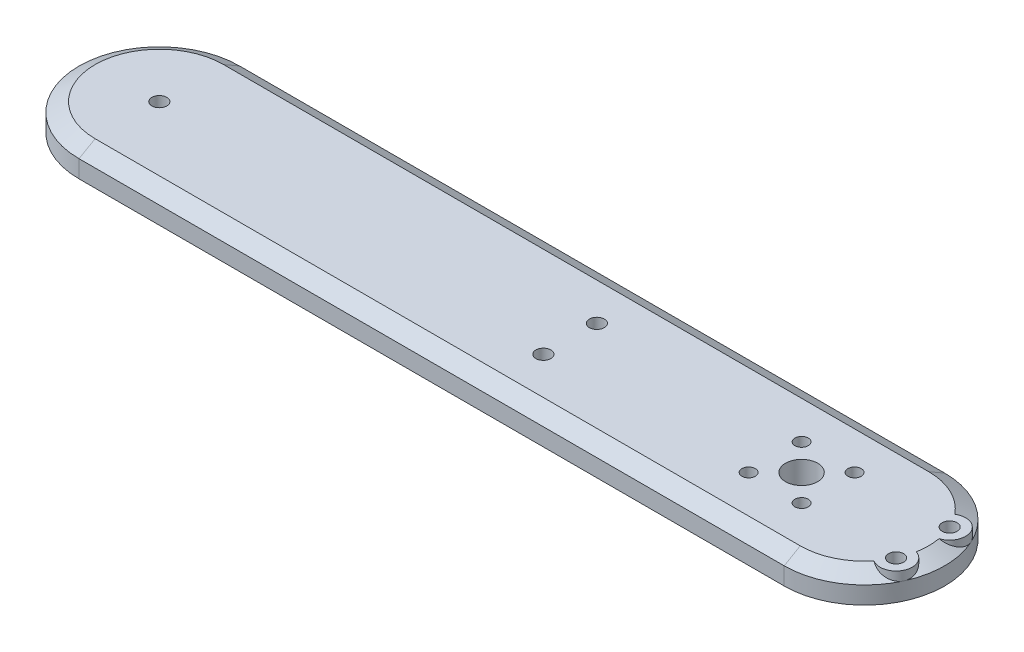
ISO-10303-21;
HEADER;
FILE_DESCRIPTION(('STEP AP214'),'2;1');
FILE_NAME('part.step','',(''),(''),'','','');
FILE_SCHEMA(('AUTOMOTIVE_DESIGN { 1 0 10303 214 1 1 1 1 }'));
ENDSEC;
DATA;
#1=APPLICATION_CONTEXT('core data for automotive mechanical design processes');
#2=APPLICATION_PROTOCOL_DEFINITION('international standard','automotive_design',2000,#1);
#3=PRODUCT_CONTEXT('',#1,'mechanical');
#4=PRODUCT('Part','Part','',(#3));
#5=PRODUCT_RELATED_PRODUCT_CATEGORY('part','',(#4));
#6=PRODUCT_DEFINITION_FORMATION('','',#4);
#7=PRODUCT_DEFINITION_CONTEXT('part definition',#1,'design');
#8=PRODUCT_DEFINITION('design','',#6,#7);
#9=PRODUCT_DEFINITION_SHAPE('','',#8);
#10=(LENGTH_UNIT() NAMED_UNIT(*) SI_UNIT(.MILLI.,.METRE.));
#11=(NAMED_UNIT(*) PLANE_ANGLE_UNIT() SI_UNIT($,.RADIAN.));
#12=(NAMED_UNIT(*) SI_UNIT($,.STERADIAN.) SOLID_ANGLE_UNIT());
#13=UNCERTAINTY_MEASURE_WITH_UNIT(LENGTH_MEASURE(1.E-05),#10,'distance_accuracy_value','');
#14=(GEOMETRIC_REPRESENTATION_CONTEXT(3) GLOBAL_UNCERTAINTY_ASSIGNED_CONTEXT((#13)) GLOBAL_UNIT_ASSIGNED_CONTEXT((#10,
#11,#12)) REPRESENTATION_CONTEXT('',''));
#15=CARTESIAN_POINT('',(0.,0.,0.));
#16=DIRECTION('',(0.,0.,1.));
#17=DIRECTION('',(1.,0.,0.));
#18=AXIS2_PLACEMENT_3D('',#15,#16,#17);
#19=CARTESIAN_POINT('',(131.75,5.,0.));
#20=DIRECTION('',(0.,-1.,0.));
#21=DIRECTION('',(0.,0.,1.));
#22=AXIS2_PLACEMENT_3D('',#19,#20,#21);
#23=CONICAL_SURFACE('',#22,12.,1.0471975511966);
#24=CARTESIAN_POINT('',(131.75,5.,0.));
#25=DIRECTION('',(0.,-1.,0.));
#26=DIRECTION('',(0.,0.,-1.));
#27=AXIS2_PLACEMENT_3D('',#24,#25,#26);
#28=CIRCLE('',#27,12.);
#29=CARTESIAN_POINT('',(141.077618933992,5.,7.54953806681159));
#30=VERTEX_POINT('',#29);
#31=CARTESIAN_POINT('',(131.75,5.,12.));
#32=VERTEX_POINT('',#31);
#33=EDGE_CURVE('E126',#30,#32,#28,.T.);
#34=ORIENTED_EDGE('',*,*,#33,.T.);
#35=DIRECTION('',(0.,0.499999999999995,-0.866025403784441));
#36=VECTOR('',#35,1.);
#37=CARTESIAN_POINT('',(131.75,3.26794919243113,15.));
#38=LINE('',#37,#36);
#39=CARTESIAN_POINT('',(131.75,3.26794919243113,15.));
#40=VERTEX_POINT('',#39);
#41=EDGE_CURVE('E157',#40,#32,#38,.T.);
#42=ORIENTED_EDGE('',*,*,#41,.F.);
#43=CARTESIAN_POINT('',(131.75,3.26794919243113,0.));
#44=DIRECTION('',(0.,-1.,0.));
#45=DIRECTION('',(0.,0.,-1.));
#46=AXIS2_PLACEMENT_3D('',#43,#44,#45);
#47=CIRCLE('',#46,15.);
#48=CARTESIAN_POINT('',(145.385890143295,3.26794919243115,6.25));
#49=VERTEX_POINT('',#48);
#50=EDGE_CURVE('E146',#40,#49,#47,.F.);
#51=ORIENTED_EDGE('',*,*,#50,.T.);
#52=CARTESIAN_POINT('',(141.077322224237,5.0002,7.54935403868238));
#53=CARTESIAN_POINT('',(141.156557252533,4.94678817044797,7.59849532245087));
#54=CARTESIAN_POINT('',(141.238157752973,4.89363214228214,7.64400414252746));
#55=CARTESIAN_POINT('',(141.405675913293,4.78807578622649,7.72739358204015));
#56=CARTESIAN_POINT('',(141.491595007884,4.73567571701977,7.76527164519904));
#57=CARTESIAN_POINT('',(141.755674700648,4.57970582150423,7.86707972239534));
#58=CARTESIAN_POINT('',(141.939658060023,4.47770274482218,7.9188722322073));
#59=CARTESIAN_POINT('',(142.318130790524,4.28039509828638,7.98681766693718));
#60=CARTESIAN_POINT('',(142.512644761588,4.18510752549572,8.00288309639194));
#61=CARTESIAN_POINT('',(142.905273479851,4.00426126042279,7.99627527436065));
#62=CARTESIAN_POINT('',(143.103381423363,3.91868603955574,7.97366892195534));
#63=CARTESIAN_POINT('',(143.479570242659,3.76653113962029,7.89137434460179));
#64=CARTESIAN_POINT('',(143.657943074556,3.69896232923984,7.83493708454001));
#65=CARTESIAN_POINT('',(143.917769278529,3.60717328589838,7.72464089293876));
#66=CARTESIAN_POINT('',(144.003120344002,3.57816170009228,7.68358149180941));
#67=CARTESIAN_POINT('',(144.170380115844,3.52357315458263,7.593048925895));
#68=CARTESIAN_POINT('',(144.252289255344,3.49799576182667,7.54357682373976));
#69=CARTESIAN_POINT('',(144.473365142052,3.43219915627915,7.39498703090635));
#70=CARTESIAN_POINT('',(144.607925303175,3.39591763412093,7.28702479306738));
#71=CARTESIAN_POINT('',(144.857786247804,3.33634694159049,7.04791607168051));
#72=CARTESIAN_POINT('',(144.973101256229,3.31304814506793,6.91678686074889));
#73=CARTESIAN_POINT('',(145.17061181912,3.28175697218575,6.64792576225177));
#74=CARTESIAN_POINT('',(145.254843331859,3.27258533345847,6.51182432536301));
#75=CARTESIAN_POINT('',(145.400634043372,3.26604279846284,6.22773560641844));
#76=CARTESIAN_POINT('',(145.46219944674,3.26866867015588,6.07975159061647));
#77=CARTESIAN_POINT('',(145.558959984953,3.28529330605756,5.78235505494448));
#78=CARTESIAN_POINT('',(145.595078374449,3.29885072054545,5.63321644011285));
#79=CARTESIAN_POINT('',(145.64412187416,3.33635060085029,5.33247956634609));
#80=CARTESIAN_POINT('',(145.657047018265,3.36029305149308,5.18088131100518));
#81=CARTESIAN_POINT('',(145.660100556809,3.41834505023927,4.87679354111265));
#82=CARTESIAN_POINT('',(145.649840452357,3.45261939971543,4.72433217892598));
#83=CARTESIAN_POINT('',(145.606972106302,3.53023187094797,4.42498204919223));
#84=CARTESIAN_POINT('',(145.574357809823,3.57357244618014,4.27809480283431));
#85=CARTESIAN_POINT('',(145.485912140682,3.67126155153085,3.98414475732932));
#86=CARTESIAN_POINT('',(145.428740320811,3.72613365451266,3.83766084394096));
#87=CARTESIAN_POINT('',(145.293933076532,3.84359357328929,3.55786580455139));
#88=CARTESIAN_POINT('',(145.216294424116,3.9061826053613,3.4245567610423));
#89=CARTESIAN_POINT('',(145.03531961341,4.04396825769636,3.16165162296553));
#90=CARTESIAN_POINT('',(144.930256154494,4.11979678183466,3.03357664651882));
#91=CARTESIAN_POINT('',(144.702831974037,4.27756085315734,2.79808492927117));
#92=CARTESIAN_POINT('',(144.580452359524,4.35950302391616,2.69069105904553));
#93=CARTESIAN_POINT('',(144.314666021577,4.53273442564728,2.49265184098019));
#94=CARTESIAN_POINT('',(144.170458773441,4.62429020833901,2.40330840728901));
#95=CARTESIAN_POINT('',(143.946044711935,4.76388810854373,2.2889431581038));
#96=CARTESIAN_POINT('',(143.869946077227,4.81076421782348,2.25411406625342));
#97=CARTESIAN_POINT('',(143.71544404268,4.90509300797885,2.19103843568445));
#98=CARTESIAN_POINT('',(143.637041267394,4.95254553060478,2.16279013139787));
#99=CARTESIAN_POINT('',(143.557677692172,5.0002,2.1378572903497));
#100=B_SPLINE_CURVE_WITH_KNOTS('',3,(#52,#53,#54,#55,#56,#57,#58,#59,#60,#61,#62,#63,#64,#65,
#66,#67,#68,#69,#70,#71,#72,#73,#74,#75,#76,#77,#78,#79,#80,#81,#82,#83,#84,#85,#86,#87,#88,#89,
#90,#91,#92,#93,#94,#95,#96,#97,#98,#99),.UNSPECIFIED.,.F.,.F.,(4,2,2,2,2,2,2,2,2,2,2,2,2,2,2,2,
2,2,2,2,2,2,2,4),(0.,0.322173911690686,0.644455571713664,1.29102840714377,1.93918296091373,
2.58621739284114,3.17927178079538,3.47602612178941,3.77274300678716,4.29849498135217,
4.82385661224603,5.30238850109786,5.78078929964634,6.24078815170038,6.70078633162677,
7.16854941823068,7.63643925366799,8.1339829991462,8.63160526375324,9.17590331670913,
9.72079987775979,10.2967240672052,10.584280375072,10.8717594450089),.UNSPECIFIED.);
#101=EDGE_CURVE('E11',#30,#49,#100,.T.);
#102=ORIENTED_EDGE('',*,*,#101,.F.);
#103=EDGE_LOOP('',(#34,#42,#51,#102));
#104=FACE_BOUND('',#103,.T.);
#105=ADVANCED_FACE('F43',(#104),#23,.T.);
#106=CARTESIAN_POINT('',(145.385890143295,3.26794919243115,-6.25));
#107=VERTEX_POINT('',#106);
#108=EDGE_CURVE('E149',#49,#107,#47,.F.);
#109=ORIENTED_EDGE('',*,*,#108,.T.);
#110=CARTESIAN_POINT('',(141.077322224237,5.0002,-7.54935403868238));
#111=CARTESIAN_POINT('',(141.156557252533,4.94678817044797,-7.59849532245087));
#112=CARTESIAN_POINT('',(141.238157752973,4.89363214228214,-7.64400414252746));
#113=CARTESIAN_POINT('',(141.405675913293,4.78807578622649,-7.72739358204015));
#114=CARTESIAN_POINT('',(141.491595007884,4.73567571701977,-7.76527164519904));
#115=CARTESIAN_POINT('',(141.755674700648,4.57970582150423,-7.86707972239534));
#116=CARTESIAN_POINT('',(141.939658060023,4.47770274482218,-7.9188722322073));
#117=CARTESIAN_POINT('',(142.318130790524,4.28039509828638,-7.98681766693718));
#118=CARTESIAN_POINT('',(142.512644761588,4.18510752549572,-8.00288309639194));
#119=CARTESIAN_POINT('',(142.905273479851,4.00426126042279,-7.99627527436065));
#120=CARTESIAN_POINT('',(143.103381423363,3.91868603955574,-7.97366892195534));
#121=CARTESIAN_POINT('',(143.479570242659,3.76653113962029,-7.89137434460179));
#122=CARTESIAN_POINT('',(143.657943074556,3.69896232923984,-7.83493708454001));
#123=CARTESIAN_POINT('',(143.917769278529,3.60717328589838,-7.72464089293876));
#124=CARTESIAN_POINT('',(144.003120344002,3.57816170009228,-7.68358149180941));
#125=CARTESIAN_POINT('',(144.170380115844,3.52357315458263,-7.593048925895));
#126=CARTESIAN_POINT('',(144.252289255344,3.49799576182667,-7.54357682373976));
#127=CARTESIAN_POINT('',(144.473365142052,3.43219915627915,-7.39498703090635));
#128=CARTESIAN_POINT('',(144.607925303175,3.39591763412093,-7.28702479306738));
#129=CARTESIAN_POINT('',(144.857786247804,3.33634694159049,-7.04791607168051));
#130=CARTESIAN_POINT('',(144.973101256229,3.31304814506793,-6.91678686074889));
#131=CARTESIAN_POINT('',(145.17061181912,3.28175697218575,-6.64792576225177));
#132=CARTESIAN_POINT('',(145.254843331859,3.27258533345847,-6.51182432536301));
#133=CARTESIAN_POINT('',(145.400634043372,3.26604279846284,-6.22773560641844));
#134=CARTESIAN_POINT('',(145.46219944674,3.26866867015588,-6.07975159061647));
#135=CARTESIAN_POINT('',(145.558959984953,3.28529330605756,-5.78235505494448));
#136=CARTESIAN_POINT('',(145.595078374449,3.29885072054545,-5.63321644011285));
#137=CARTESIAN_POINT('',(145.64412187416,3.33635060085029,-5.33247956634609));
#138=CARTESIAN_POINT('',(145.657047018265,3.36029305149308,-5.18088131100518));
#139=CARTESIAN_POINT('',(145.660100556809,3.41834505023927,-4.87679354111265));
#140=CARTESIAN_POINT('',(145.649840452357,3.45261939971543,-4.72433217892598));
#141=CARTESIAN_POINT('',(145.606972106302,3.53023187094797,-4.42498204919223));
#142=CARTESIAN_POINT('',(145.574357809823,3.57357244618014,-4.27809480283431));
#143=CARTESIAN_POINT('',(145.485912140682,3.67126155153085,-3.98414475732932));
#144=CARTESIAN_POINT('',(145.428740320811,3.72613365451266,-3.83766084394096));
#145=CARTESIAN_POINT('',(145.293933076532,3.84359357328929,-3.55786580455139));
#146=CARTESIAN_POINT('',(145.216294424116,3.9061826053613,-3.4245567610423));
#147=CARTESIAN_POINT('',(145.03531961341,4.04396825769636,-3.16165162296553));
#148=CARTESIAN_POINT('',(144.930256154494,4.11979678183466,-3.03357664651882));
#149=CARTESIAN_POINT('',(144.702831974037,4.27756085315734,-2.79808492927117));
#150=CARTESIAN_POINT('',(144.580452359524,4.35950302391616,-2.69069105904553));
#151=CARTESIAN_POINT('',(144.314666021577,4.53273442564728,-2.49265184098019));
#152=CARTESIAN_POINT('',(144.170458773441,4.62429020833901,-2.40330840728901));
#153=CARTESIAN_POINT('',(143.946044711935,4.76388810854373,-2.2889431581038));
#154=CARTESIAN_POINT('',(143.869946077227,4.81076421782348,-2.25411406625342));
#155=CARTESIAN_POINT('',(143.71544404268,4.90509300797885,-2.19103843568445));
#156=CARTESIAN_POINT('',(143.637041267394,4.95254553060478,-2.16279013139787));
#157=CARTESIAN_POINT('',(143.557677692172,5.0002,-2.1378572903497));
#158=B_SPLINE_CURVE_WITH_KNOTS('',3,(#110,#111,#112,#113,#114,#115,#116,#117,#118,#119,#120,
#121,#122,#123,#124,#125,#126,#127,#128,#129,#130,#131,#132,#133,#134,#135,#136,#137,#138,#139,
#140,#141,#142,#143,#144,#145,#146,#147,#148,#149,#150,#151,#152,#153,#154,#155,#156,#157),
.UNSPECIFIED.,.F.,.F.,(4,2,2,2,2,2,2,2,2,2,2,2,2,2,2,2,2,2,2,2,2,2,2,4),(0.,0.322173911690686,
0.644455571713664,1.29102840714377,1.93918296091373,2.58621739284114,3.17927178079538,
3.47602612178941,3.77274300678716,4.29849498135217,4.82385661224603,5.30238850109786,
5.78078929964634,6.24078815170038,6.70078633162677,7.16854941823068,7.63643925366799,
8.1339829991462,8.63160526375324,9.17590331670913,9.72079987775979,10.2967240672052,
10.584280375072,10.8717594450089),.UNSPECIFIED.);
#159=CARTESIAN_POINT('',(143.558010788115,5.,-2.13796193318842));
#160=VERTEX_POINT('',#159);
#161=EDGE_CURVE('E137',#107,#160,#158,.T.);
#162=ORIENTED_EDGE('',*,*,#161,.T.);
#163=CARTESIAN_POINT('',(143.558010788115,5.,2.13796193318843));
#164=VERTEX_POINT('',#163);
#165=EDGE_CURVE('E123',#160,#164,#28,.T.);
#166=ORIENTED_EDGE('',*,*,#165,.T.);
#167=EDGE_CURVE('E47',#49,#164,#100,.T.);
#168=ORIENTED_EDGE('',*,*,#167,.F.);
#169=EDGE_LOOP('',(#109,#162,#166,#168));
#170=FACE_BOUND('',#169,.T.);
#171=ADVANCED_FACE('F136',(#170),#23,.T.);
#172=CARTESIAN_POINT('',(141.077618933992,5.,-7.54953806681159));
#173=VERTEX_POINT('',#172);
#174=EDGE_CURVE('E135',#173,#107,#158,.T.);
#175=ORIENTED_EDGE('',*,*,#174,.T.);
#176=CARTESIAN_POINT('',(131.75,3.26794919243113,-15.));
#177=VERTEX_POINT('',#176);
#178=EDGE_CURVE('E141',#107,#177,#47,.F.);
#179=ORIENTED_EDGE('',*,*,#178,.T.);
#180=DIRECTION('',(0.,-0.499999999999995,-0.866025403784441));
#181=VECTOR('',#180,1.);
#182=CARTESIAN_POINT('',(131.75,5.,-12.));
#183=LINE('',#182,#181);
#184=CARTESIAN_POINT('',(131.75,5.,-12.));
#185=VERTEX_POINT('',#184);
#186=EDGE_CURVE('E160',#185,#177,#183,.T.);
#187=ORIENTED_EDGE('',*,*,#186,.F.);
#188=EDGE_CURVE('E138',#185,#173,#28,.T.);
#189=ORIENTED_EDGE('',*,*,#188,.T.);
#190=EDGE_LOOP('',(#175,#179,#187,#189));
#191=FACE_BOUND('',#190,.T.);
#192=ADVANCED_FACE('F182',(#191),#23,.T.);
#193=CARTESIAN_POINT('',(0.,5.,0.));
#194=DIRECTION('',(0.,1.,0.));
#195=DIRECTION('',(0.,0.,-1.));
#196=AXIS2_PLACEMENT_3D('',#193,#194,#195);
#197=PLANE('',#196);
#198=CARTESIAN_POINT('',(142.658712114636,5.,5.));
#199=DIRECTION('',(0.,1.,0.));
#200=DIRECTION('',(0.,0.,1.));
#201=AXIS2_PLACEMENT_3D('',#198,#199,#200);
#202=CIRCLE('',#201,1.4);
#203=CARTESIAN_POINT('',(142.658712114636,5.,6.40000000000001));
#204=VERTEX_POINT('',#203);
#205=EDGE_CURVE('E305',#204,#204,#202,.T.);
#206=ORIENTED_EDGE('',*,*,#205,.F.);
#207=EDGE_LOOP('',(#206));
#208=FACE_BOUND('',#207,.T.);
#209=CARTESIAN_POINT('',(142.658712114636,5.,-5.));
#210=DIRECTION('',(0.,-1.,0.));
#211=DIRECTION('',(0.,0.,-1.));
#212=AXIS2_PLACEMENT_3D('',#209,#210,#211);
#213=CIRCLE('',#212,1.4);
#214=CARTESIAN_POINT('',(142.658712114636,5.,-6.40000000000001));
#215=VERTEX_POINT('',#214);
#216=EDGE_CURVE('E127',#215,#215,#213,.T.);
#217=ORIENTED_EDGE('',*,*,#216,.T.);
#218=EDGE_LOOP('',(#217));
#219=FACE_BOUND('',#218,.T.);
#220=ORIENTED_EDGE('',*,*,#165,.F.);
#221=CARTESIAN_POINT('',(142.658712114636,5.,-5.));
#222=DIRECTION('',(0.,-1.,0.));
#223=DIRECTION('',(0.,0.,-1.));
#224=AXIS2_PLACEMENT_3D('',#221,#222,#223);
#225=CIRCLE('',#224,2.99999999999999);
#226=EDGE_CURVE('E71',#173,#160,#225,.T.);
#227=ORIENTED_EDGE('',*,*,#226,.F.);
#228=ORIENTED_EDGE('',*,*,#188,.F.);
#229=DIRECTION('',(1.,0.,0.));
#230=VECTOR('',#229,1.);
#231=CARTESIAN_POINT('',(131.75,5.,-12.));
#232=LINE('',#231,#230);
#233=CARTESIAN_POINT('',(0.,5.,-12.));
#234=VERTEX_POINT('',#233);
#235=EDGE_CURVE('E142',#234,#185,#232,.T.);
#236=ORIENTED_EDGE('',*,*,#235,.F.);
#237=CARTESIAN_POINT('',(0.,5.,0.));
#238=DIRECTION('',(0.,-1.,0.));
#239=DIRECTION('',(0.,0.,-1.));
#240=AXIS2_PLACEMENT_3D('',#237,#238,#239);
#241=CIRCLE('',#240,12.);
#242=CARTESIAN_POINT('',(0.,5.,12.));
#243=VERTEX_POINT('',#242);
#244=EDGE_CURVE('E203',#243,#234,#241,.T.);
#245=ORIENTED_EDGE('',*,*,#244,.F.);
#246=DIRECTION('',(-1.,0.,0.));
#247=VECTOR('',#246,1.);
#248=CARTESIAN_POINT('',(0.,5.,12.));
#249=LINE('',#248,#247);
#250=EDGE_CURVE('E205',#32,#243,#249,.T.);
#251=ORIENTED_EDGE('',*,*,#250,.F.);
#252=ORIENTED_EDGE('',*,*,#33,.F.);
#253=CARTESIAN_POINT('',(142.658712114636,5.,5.));
#254=DIRECTION('',(0.,1.,0.));
#255=DIRECTION('',(0.,0.,1.));
#256=AXIS2_PLACEMENT_3D('',#253,#254,#255);
#257=CIRCLE('',#256,2.99999999999999);
#258=EDGE_CURVE('E63',#30,#164,#257,.T.);
#259=ORIENTED_EDGE('',*,*,#258,.T.);
#260=EDGE_LOOP('',(#220,#227,#228,#236,#245,#251,#252,#259));
#261=FACE_BOUND('',#260,.T.);
#262=CARTESIAN_POINT('',(76.75,5.,4.99999999999999));
#263=DIRECTION('',(0.,-1.,0.));
#264=DIRECTION('',(0.,0.,-1.));
#265=AXIS2_PLACEMENT_3D('',#262,#263,#264);
#266=CIRCLE('',#265,1.4);
#267=CARTESIAN_POINT('',(76.75,5.,3.59999999999999));
#268=VERTEX_POINT('',#267);
#269=EDGE_CURVE('E294',#268,#268,#266,.T.);
#270=ORIENTED_EDGE('',*,*,#269,.T.);
#271=EDGE_LOOP('',(#270));
#272=FACE_BOUND('',#271,.T.);
#273=CARTESIAN_POINT('',(76.75,5.,-5.00000000000001));
#274=DIRECTION('',(0.,-1.,0.));
#275=DIRECTION('',(0.,0.,1.));
#276=AXIS2_PLACEMENT_3D('',#273,#274,#275);
#277=CIRCLE('',#276,1.4);
#278=CARTESIAN_POINT('',(76.75,5.,-3.60000000000001));
#279=VERTEX_POINT('',#278);
#280=EDGE_CURVE('E291',#279,#279,#277,.T.);
#281=ORIENTED_EDGE('',*,*,#280,.T.);
#282=EDGE_LOOP('',(#281));
#283=FACE_BOUND('',#282,.T.);
#284=CARTESIAN_POINT('',(124.949747468306,5.,-4.9497474683058));
#285=DIRECTION('',(0.,-1.,0.));
#286=DIRECTION('',(0.,0.,-1.));
#287=AXIS2_PLACEMENT_3D('',#284,#285,#286);
#288=CIRCLE('',#287,1.25000000000001);
#289=CARTESIAN_POINT('',(124.949747468306,5.,-6.19974746830581));
#290=VERTEX_POINT('',#289);
#291=EDGE_CURVE('E275',#290,#290,#288,.T.);
#292=ORIENTED_EDGE('',*,*,#291,.T.);
#293=EDGE_LOOP('',(#292));
#294=FACE_BOUND('',#293,.T.);
#295=CARTESIAN_POINT('',(124.949747468306,5.,4.94974746830584));
#296=DIRECTION('',(0.,-1.,0.));
#297=DIRECTION('',(0.,0.,-1.));
#298=AXIS2_PLACEMENT_3D('',#295,#296,#297);
#299=CIRCLE('',#298,1.25);
#300=CARTESIAN_POINT('',(124.949747468306,5.,3.69974746830585));
#301=VERTEX_POINT('',#300);
#302=EDGE_CURVE('E263',#301,#301,#299,.T.);
#303=ORIENTED_EDGE('',*,*,#302,.T.);
#304=EDGE_LOOP('',(#303));
#305=FACE_BOUND('',#304,.T.);
#306=CARTESIAN_POINT('',(120.,5.,0.));
#307=DIRECTION('',(0.,-1.,0.));
#308=DIRECTION('',(0.,0.,-1.));
#309=AXIS2_PLACEMENT_3D('',#306,#307,#308);
#310=CIRCLE('',#309,2.99999999999999);
#311=CARTESIAN_POINT('',(120.,5.,-2.99999999999999));
#312=VERTEX_POINT('',#311);
#313=EDGE_CURVE('E250',#312,#312,#310,.T.);
#314=ORIENTED_EDGE('',*,*,#313,.T.);
#315=EDGE_LOOP('',(#314));
#316=FACE_BOUND('',#315,.T.);
#317=CARTESIAN_POINT('',(115.050252531694,5.,4.9497474683058));
#318=DIRECTION('',(0.,-1.,0.));
#319=DIRECTION('',(0.,0.,-1.));
#320=AXIS2_PLACEMENT_3D('',#317,#318,#319);
#321=CIRCLE('',#320,1.25);
#322=CARTESIAN_POINT('',(115.050252531694,5.,3.6997474683058));
#323=VERTEX_POINT('',#322);
#324=EDGE_CURVE('E258',#323,#323,#321,.T.);
#325=ORIENTED_EDGE('',*,*,#324,.T.);
#326=EDGE_LOOP('',(#325));
#327=FACE_BOUND('',#326,.T.);
#328=CARTESIAN_POINT('',(0.,5.,0.));
#329=DIRECTION('',(0.,-1.,0.));
#330=DIRECTION('',(0.,0.,-1.));
#331=AXIS2_PLACEMENT_3D('',#328,#329,#330);
#332=CIRCLE('',#331,1.4);
#333=CARTESIAN_POINT('',(0.,5.,-1.4));
#334=VERTEX_POINT('',#333);
#335=EDGE_CURVE('E269',#334,#334,#332,.T.);
#336=ORIENTED_EDGE('',*,*,#335,.T.);
#337=EDGE_LOOP('',(#336));
#338=FACE_BOUND('',#337,.T.);
#339=CARTESIAN_POINT('',(115.050252531694,5.,-4.94974746830584));
#340=DIRECTION('',(0.,-1.,0.));
#341=DIRECTION('',(0.,0.,-1.));
#342=AXIS2_PLACEMENT_3D('',#339,#340,#341);
#343=CIRCLE('',#342,1.25);
#344=CARTESIAN_POINT('',(115.050252531694,5.,-6.19974746830584));
#345=VERTEX_POINT('',#344);
#346=EDGE_CURVE('E281',#345,#345,#343,.T.);
#347=ORIENTED_EDGE('',*,*,#346,.T.);
#348=EDGE_LOOP('',(#347));
#349=FACE_BOUND('',#348,.T.);
#350=ADVANCED_FACE('F120',(#208,#219,#261,#272,#283,#294,#305,#316,#327,#338,#349),#197,.T.);
#351=CARTESIAN_POINT('',(0.,0.,0.));
#352=DIRECTION('',(0.,1.,0.));
#353=DIRECTION('',(0.,0.,-1.));
#354=AXIS2_PLACEMENT_3D('',#351,#352,#353);
#355=PLANE('',#354);
#356=CARTESIAN_POINT('',(142.658712114636,0.,5.));
#357=DIRECTION('',(0.,1.,0.));
#358=DIRECTION('',(0.,0.,1.));
#359=AXIS2_PLACEMENT_3D('',#356,#357,#358);
#360=CIRCLE('',#359,1.4);
#361=CARTESIAN_POINT('',(142.658712114636,0.,6.40000000000001));
#362=VERTEX_POINT('',#361);
#363=EDGE_CURVE('E128',#362,#362,#360,.T.);
#364=ORIENTED_EDGE('',*,*,#363,.T.);
#365=EDGE_LOOP('',(#364));
#366=FACE_BOUND('',#365,.T.);
#367=CARTESIAN_POINT('',(142.658712114636,0.,-5.));
#368=DIRECTION('',(0.,-1.,0.));
#369=DIRECTION('',(0.,0.,-1.));
#370=AXIS2_PLACEMENT_3D('',#367,#368,#369);
#371=CIRCLE('',#370,1.4);
#372=CARTESIAN_POINT('',(142.658712114636,0.,-6.40000000000001));
#373=VERTEX_POINT('',#372);
#374=EDGE_CURVE('E300',#373,#373,#371,.T.);
#375=ORIENTED_EDGE('',*,*,#374,.F.);
#376=EDGE_LOOP('',(#375));
#377=FACE_BOUND('',#376,.T.);
#378=CARTESIAN_POINT('',(76.75,0.,4.99999999999999));
#379=DIRECTION('',(0.,-1.,0.));
#380=DIRECTION('',(0.,0.,-1.));
#381=AXIS2_PLACEMENT_3D('',#378,#379,#380);
#382=CIRCLE('',#381,1.4);
#383=CARTESIAN_POINT('',(76.75,0.,3.59999999999999));
#384=VERTEX_POINT('',#383);
#385=EDGE_CURVE('E161',#384,#384,#382,.T.);
#386=ORIENTED_EDGE('',*,*,#385,.F.);
#387=EDGE_LOOP('',(#386));
#388=FACE_BOUND('',#387,.T.);
#389=CARTESIAN_POINT('',(76.75,0.,-5.00000000000001));
#390=DIRECTION('',(0.,-1.,0.));
#391=DIRECTION('',(0.,0.,1.));
#392=AXIS2_PLACEMENT_3D('',#389,#390,#391);
#393=CIRCLE('',#392,1.4);
#394=CARTESIAN_POINT('',(76.75,0.,-3.60000000000001));
#395=VERTEX_POINT('',#394);
#396=EDGE_CURVE('E288',#395,#395,#393,.T.);
#397=ORIENTED_EDGE('',*,*,#396,.F.);
#398=EDGE_LOOP('',(#397));
#399=FACE_BOUND('',#398,.T.);
#400=DIRECTION('',(-1.,0.,0.));
#401=VECTOR('',#400,1.);
#402=CARTESIAN_POINT('',(0.,0.,15.));
#403=LINE('',#402,#401);
#404=CARTESIAN_POINT('',(131.75,0.,15.));
#405=VERTEX_POINT('',#404);
#406=CARTESIAN_POINT('',(0.,0.,15.));
#407=VERTEX_POINT('',#406);
#408=EDGE_CURVE('E224',#405,#407,#403,.T.);
#409=ORIENTED_EDGE('',*,*,#408,.T.);
#410=CARTESIAN_POINT('',(0.,0.,0.));
#411=DIRECTION('',(0.,-1.,0.));
#412=DIRECTION('',(0.,0.,-1.));
#413=AXIS2_PLACEMENT_3D('',#410,#411,#412);
#414=CIRCLE('',#413,15.);
#415=CARTESIAN_POINT('',(0.,0.,-15.));
#416=VERTEX_POINT('',#415);
#417=EDGE_CURVE('E240',#407,#416,#414,.T.);
#418=ORIENTED_EDGE('',*,*,#417,.T.);
#419=DIRECTION('',(1.,0.,0.));
#420=VECTOR('',#419,1.);
#421=CARTESIAN_POINT('',(0.,0.,-15.));
#422=LINE('',#421,#420);
#423=CARTESIAN_POINT('',(131.75,0.,-15.));
#424=VERTEX_POINT('',#423);
#425=EDGE_CURVE('E243',#416,#424,#422,.T.);
#426=ORIENTED_EDGE('',*,*,#425,.T.);
#427=CARTESIAN_POINT('',(131.75,0.,0.));
#428=DIRECTION('',(0.,-1.,0.));
#429=DIRECTION('',(0.,0.,-1.));
#430=AXIS2_PLACEMENT_3D('',#427,#428,#429);
#431=CIRCLE('',#430,15.);
#432=EDGE_CURVE('E246',#424,#405,#431,.T.);
#433=ORIENTED_EDGE('',*,*,#432,.T.);
#434=EDGE_LOOP('',(#409,#418,#426,#433));
#435=FACE_BOUND('',#434,.T.);
#436=CARTESIAN_POINT('',(120.,0.,0.));
#437=DIRECTION('',(0.,-1.,0.));
#438=DIRECTION('',(0.,0.,-1.));
#439=AXIS2_PLACEMENT_3D('',#436,#437,#438);
#440=CIRCLE('',#439,2.99999999999999);
#441=CARTESIAN_POINT('',(120.,0.,-2.99999999999999));
#442=VERTEX_POINT('',#441);
#443=EDGE_CURVE('E253',#442,#442,#440,.T.);
#444=ORIENTED_EDGE('',*,*,#443,.F.);
#445=EDGE_LOOP('',(#444));
#446=FACE_BOUND('',#445,.T.);
#447=CARTESIAN_POINT('',(115.050252531694,0.,4.9497474683058));
#448=DIRECTION('',(0.,-1.,0.));
#449=DIRECTION('',(0.,0.,-1.));
#450=AXIS2_PLACEMENT_3D('',#447,#448,#449);
#451=CIRCLE('',#450,1.25);
#452=CARTESIAN_POINT('',(115.050252531694,0.,3.6997474683058));
#453=VERTEX_POINT('',#452);
#454=EDGE_CURVE('E260',#453,#453,#451,.T.);
#455=ORIENTED_EDGE('',*,*,#454,.F.);
#456=EDGE_LOOP('',(#455));
#457=FACE_BOUND('',#456,.T.);
#458=CARTESIAN_POINT('',(124.949747468306,0.,4.94974746830584));
#459=DIRECTION('',(0.,-1.,0.));
#460=DIRECTION('',(0.,0.,-1.));
#461=AXIS2_PLACEMENT_3D('',#458,#459,#460);
#462=CIRCLE('',#461,1.25);
#463=CARTESIAN_POINT('',(124.949747468306,0.,3.69974746830585));
#464=VERTEX_POINT('',#463);
#465=EDGE_CURVE('E266',#464,#464,#462,.T.);
#466=ORIENTED_EDGE('',*,*,#465,.F.);
#467=EDGE_LOOP('',(#466));
#468=FACE_BOUND('',#467,.T.);
#469=CARTESIAN_POINT('',(0.,0.,0.));
#470=DIRECTION('',(0.,-1.,0.));
#471=DIRECTION('',(0.,0.,-1.));
#472=AXIS2_PLACEMENT_3D('',#469,#470,#471);
#473=CIRCLE('',#472,1.4);
#474=CARTESIAN_POINT('',(0.,0.,-1.4));
#475=VERTEX_POINT('',#474);
#476=EDGE_CURVE('E272',#475,#475,#473,.T.);
#477=ORIENTED_EDGE('',*,*,#476,.F.);
#478=EDGE_LOOP('',(#477));
#479=FACE_BOUND('',#478,.T.);
#480=CARTESIAN_POINT('',(124.949747468306,0.,-4.9497474683058));
#481=DIRECTION('',(0.,-1.,0.));
#482=DIRECTION('',(0.,0.,-1.));
#483=AXIS2_PLACEMENT_3D('',#480,#481,#482);
#484=CIRCLE('',#483,1.25000000000001);
#485=CARTESIAN_POINT('',(124.949747468306,0.,-6.19974746830581));
#486=VERTEX_POINT('',#485);
#487=EDGE_CURVE('E278',#486,#486,#484,.T.);
#488=ORIENTED_EDGE('',*,*,#487,.F.);
#489=EDGE_LOOP('',(#488));
#490=FACE_BOUND('',#489,.T.);
#491=CARTESIAN_POINT('',(115.050252531694,0.,-4.94974746830584));
#492=DIRECTION('',(0.,-1.,0.));
#493=DIRECTION('',(0.,0.,-1.));
#494=AXIS2_PLACEMENT_3D('',#491,#492,#493);
#495=CIRCLE('',#494,1.25);
#496=CARTESIAN_POINT('',(115.050252531694,0.,-6.19974746830584));
#497=VERTEX_POINT('',#496);
#498=EDGE_CURVE('E167',#497,#497,#495,.T.);
#499=ORIENTED_EDGE('',*,*,#498,.F.);
#500=EDGE_LOOP('',(#499));
#501=FACE_BOUND('',#500,.T.);
#502=ADVANCED_FACE('F248',(#366,#377,#388,#399,#435,#446,#457,#468,#479,#490,#501),#355,.F.);
#503=CARTESIAN_POINT('',(0.,5.,0.));
#504=DIRECTION('',(0.,-1.,0.));
#505=DIRECTION('',(0.,0.,1.));
#506=AXIS2_PLACEMENT_3D('',#503,#504,#505);
#507=CYLINDRICAL_SURFACE('',#506,15.);
#508=DIRECTION('',(0.,-1.,0.));
#509=VECTOR('',#508,1.);
#510=CARTESIAN_POINT('',(0.,5.,-15.));
#511=LINE('',#510,#509);
#512=CARTESIAN_POINT('',(0.,3.26794919243113,-15.));
#513=VERTEX_POINT('',#512);
#514=EDGE_CURVE('E228',#513,#416,#511,.T.);
#515=ORIENTED_EDGE('',*,*,#514,.T.);
#516=ORIENTED_EDGE('',*,*,#417,.F.);
#517=DIRECTION('',(0.,-1.,0.));
#518=VECTOR('',#517,1.);
#519=CARTESIAN_POINT('',(0.,5.,15.));
#520=LINE('',#519,#518);
#521=CARTESIAN_POINT('',(0.,3.26794919243113,15.));
#522=VERTEX_POINT('',#521);
#523=EDGE_CURVE('E226',#522,#407,#520,.T.);
#524=ORIENTED_EDGE('',*,*,#523,.F.);
#525=CARTESIAN_POINT('',(0.,3.26794919243113,0.));
#526=DIRECTION('',(0.,-1.,0.));
#527=DIRECTION('',(0.,0.,-1.));
#528=AXIS2_PLACEMENT_3D('',#525,#526,#527);
#529=CIRCLE('',#528,15.);
#530=EDGE_CURVE('E152',#513,#522,#529,.F.);
#531=ORIENTED_EDGE('',*,*,#530,.F.);
#532=EDGE_LOOP('',(#515,#516,#524,#531));
#533=FACE_BOUND('',#532,.T.);
#534=ADVANCED_FACE('F183',(#533),#507,.T.);
#535=CARTESIAN_POINT('',(0.,5.,-15.));
#536=DIRECTION('',(0.,0.,1.));
#537=DIRECTION('',(-1.,0.,0.));
#538=AXIS2_PLACEMENT_3D('',#535,#536,#537);
#539=PLANE('',#538);
#540=DIRECTION('',(0.,-1.,0.));
#541=VECTOR('',#540,1.);
#542=CARTESIAN_POINT('',(131.75,5.,-15.));
#543=LINE('',#542,#541);
#544=EDGE_CURVE('E225',#177,#424,#543,.T.);
#545=ORIENTED_EDGE('',*,*,#544,.T.);
#546=ORIENTED_EDGE('',*,*,#425,.F.);
#547=ORIENTED_EDGE('',*,*,#514,.F.);
#548=DIRECTION('',(-1.,0.,0.));
#549=VECTOR('',#548,1.);
#550=CARTESIAN_POINT('',(0.,3.26794919243113,-15.));
#551=LINE('',#550,#549);
#552=EDGE_CURVE('E148',#177,#513,#551,.T.);
#553=ORIENTED_EDGE('',*,*,#552,.F.);
#554=EDGE_LOOP('',(#545,#546,#547,#553));
#555=FACE_BOUND('',#554,.T.);
#556=ADVANCED_FACE('F244',(#555),#539,.F.);
#557=CARTESIAN_POINT('',(131.75,5.,0.));
#558=DIRECTION('',(0.,-1.,0.));
#559=DIRECTION('',(0.,0.,1.));
#560=AXIS2_PLACEMENT_3D('',#557,#558,#559);
#561=CYLINDRICAL_SURFACE('',#560,15.);
#562=ORIENTED_EDGE('',*,*,#432,.F.);
#563=ORIENTED_EDGE('',*,*,#544,.F.);
#564=ORIENTED_EDGE('',*,*,#178,.F.);
#565=ORIENTED_EDGE('',*,*,#108,.F.);
#566=ORIENTED_EDGE('',*,*,#50,.F.);
#567=DIRECTION('',(0.,-1.,0.));
#568=VECTOR('',#567,1.);
#569=CARTESIAN_POINT('',(131.75,5.,15.));
#570=LINE('',#569,#568);
#571=EDGE_CURVE('E217',#40,#405,#570,.T.);
#572=ORIENTED_EDGE('',*,*,#571,.T.);
#573=EDGE_LOOP('',(#562,#563,#564,#565,#566,#572));
#574=FACE_BOUND('',#573,.T.);
#575=ADVANCED_FACE('F214',(#574),#561,.T.);
#576=CARTESIAN_POINT('',(0.,5.,15.));
#577=DIRECTION('',(0.,0.,-1.));
#578=DIRECTION('',(1.,0.,0.));
#579=AXIS2_PLACEMENT_3D('',#576,#577,#578);
#580=PLANE('',#579);
#581=ORIENTED_EDGE('',*,*,#523,.T.);
#582=ORIENTED_EDGE('',*,*,#408,.F.);
#583=ORIENTED_EDGE('',*,*,#571,.F.);
#584=DIRECTION('',(1.,0.,0.));
#585=VECTOR('',#584,1.);
#586=CARTESIAN_POINT('',(131.75,3.26794919243113,15.));
#587=LINE('',#586,#585);
#588=EDGE_CURVE('E155',#522,#40,#587,.T.);
#589=ORIENTED_EDGE('',*,*,#588,.F.);
#590=EDGE_LOOP('',(#581,#582,#583,#589));
#591=FACE_BOUND('',#590,.T.);
#592=ADVANCED_FACE('F222',(#591),#580,.F.);
#593=CARTESIAN_POINT('',(120.,5.,0.));
#594=DIRECTION('',(0.,-1.,0.));
#595=DIRECTION('',(0.,0.,1.));
#596=AXIS2_PLACEMENT_3D('',#593,#594,#595);
#597=CYLINDRICAL_SURFACE('',#596,2.99999999999999);
#598=ORIENTED_EDGE('',*,*,#313,.F.);
#599=EDGE_LOOP('',(#598));
#600=FACE_BOUND('',#599,.T.);
#601=ORIENTED_EDGE('',*,*,#443,.T.);
#602=EDGE_LOOP('',(#601));
#603=FACE_BOUND('',#602,.T.);
#604=ADVANCED_FACE('F382',(#600,#603),#597,.F.);
#605=CARTESIAN_POINT('',(115.050252531694,5.,4.9497474683058));
#606=DIRECTION('',(0.,-1.,0.));
#607=DIRECTION('',(0.,0.,1.));
#608=AXIS2_PLACEMENT_3D('',#605,#606,#607);
#609=CYLINDRICAL_SURFACE('',#608,1.25);
#610=ORIENTED_EDGE('',*,*,#324,.F.);
#611=EDGE_LOOP('',(#610));
#612=FACE_BOUND('',#611,.T.);
#613=ORIENTED_EDGE('',*,*,#454,.T.);
#614=EDGE_LOOP('',(#613));
#615=FACE_BOUND('',#614,.T.);
#616=ADVANCED_FACE('F378',(#612,#615),#609,.F.);
#617=CARTESIAN_POINT('',(124.949747468306,5.,4.94974746830584));
#618=DIRECTION('',(0.,-1.,0.));
#619=DIRECTION('',(0.,0.,1.));
#620=AXIS2_PLACEMENT_3D('',#617,#618,#619);
#621=CYLINDRICAL_SURFACE('',#620,1.25);
#622=ORIENTED_EDGE('',*,*,#302,.F.);
#623=EDGE_LOOP('',(#622));
#624=FACE_BOUND('',#623,.T.);
#625=ORIENTED_EDGE('',*,*,#465,.T.);
#626=EDGE_LOOP('',(#625));
#627=FACE_BOUND('',#626,.T.);
#628=ADVANCED_FACE('F374',(#624,#627),#621,.F.);
#629=CARTESIAN_POINT('',(0.,5.,0.));
#630=DIRECTION('',(0.,-1.,0.));
#631=DIRECTION('',(0.,0.,1.));
#632=AXIS2_PLACEMENT_3D('',#629,#630,#631);
#633=CYLINDRICAL_SURFACE('',#632,1.4);
#634=ORIENTED_EDGE('',*,*,#335,.F.);
#635=EDGE_LOOP('',(#634));
#636=FACE_BOUND('',#635,.T.);
#637=ORIENTED_EDGE('',*,*,#476,.T.);
#638=EDGE_LOOP('',(#637));
#639=FACE_BOUND('',#638,.T.);
#640=ADVANCED_FACE('F368',(#636,#639),#633,.F.);
#641=CARTESIAN_POINT('',(124.949747468306,5.,-4.9497474683058));
#642=DIRECTION('',(0.,-1.,0.));
#643=DIRECTION('',(0.,0.,1.));
#644=AXIS2_PLACEMENT_3D('',#641,#642,#643);
#645=CYLINDRICAL_SURFACE('',#644,1.25000000000001);
#646=ORIENTED_EDGE('',*,*,#291,.F.);
#647=EDGE_LOOP('',(#646));
#648=FACE_BOUND('',#647,.T.);
#649=ORIENTED_EDGE('',*,*,#487,.T.);
#650=EDGE_LOOP('',(#649));
#651=FACE_BOUND('',#650,.T.);
#652=ADVANCED_FACE('F361',(#648,#651),#645,.F.);
#653=CARTESIAN_POINT('',(115.050252531694,5.,-4.94974746830584));
#654=DIRECTION('',(0.,-1.,0.));
#655=DIRECTION('',(0.,0.,1.));
#656=AXIS2_PLACEMENT_3D('',#653,#654,#655);
#657=CYLINDRICAL_SURFACE('',#656,1.25);
#658=ORIENTED_EDGE('',*,*,#346,.F.);
#659=EDGE_LOOP('',(#658));
#660=FACE_BOUND('',#659,.T.);
#661=ORIENTED_EDGE('',*,*,#498,.T.);
#662=EDGE_LOOP('',(#661));
#663=FACE_BOUND('',#662,.T.);
#664=ADVANCED_FACE('F196',(#660,#663),#657,.F.);
#665=CARTESIAN_POINT('',(0.,5.,0.));
#666=DIRECTION('',(0.,-1.,0.));
#667=DIRECTION('',(0.,0.,1.));
#668=AXIS2_PLACEMENT_3D('',#665,#666,#667);
#669=CONICAL_SURFACE('',#668,12.,1.0471975511966);
#670=DIRECTION('',(0.,0.499999999999995,-0.866025403784441));
#671=VECTOR('',#670,1.);
#672=CARTESIAN_POINT('',(0.,3.26794919243113,15.));
#673=LINE('',#672,#671);
#674=EDGE_CURVE('E164',#522,#243,#673,.T.);
#675=ORIENTED_EDGE('',*,*,#674,.T.);
#676=ORIENTED_EDGE('',*,*,#244,.T.);
#677=DIRECTION('',(0.,-0.499999999999995,-0.866025403784441));
#678=VECTOR('',#677,1.);
#679=CARTESIAN_POINT('',(0.,5.,-12.));
#680=LINE('',#679,#678);
#681=EDGE_CURVE('E166',#234,#513,#680,.T.);
#682=ORIENTED_EDGE('',*,*,#681,.T.);
#683=ORIENTED_EDGE('',*,*,#530,.T.);
#684=EDGE_LOOP('',(#675,#676,#682,#683));
#685=FACE_BOUND('',#684,.T.);
#686=ADVANCED_FACE('F45',(#685),#669,.T.);
#687=CARTESIAN_POINT('',(0.,5.,-12.));
#688=DIRECTION('',(0.,0.866025403784441,-0.499999999999995));
#689=DIRECTION('',(-1.,0.,0.));
#690=AXIS2_PLACEMENT_3D('',#687,#688,#689);
#691=PLANE('',#690);
#692=ORIENTED_EDGE('',*,*,#681,.F.);
#693=ORIENTED_EDGE('',*,*,#235,.T.);
#694=ORIENTED_EDGE('',*,*,#186,.T.);
#695=ORIENTED_EDGE('',*,*,#552,.T.);
#696=EDGE_LOOP('',(#692,#693,#694,#695));
#697=FACE_BOUND('',#696,.T.);
#698=ADVANCED_FACE('F189',(#697),#691,.T.);
#699=CARTESIAN_POINT('',(0.,5.,12.));
#700=DIRECTION('',(0.,0.866025403784441,0.499999999999995));
#701=DIRECTION('',(1.,0.,0.));
#702=AXIS2_PLACEMENT_3D('',#699,#700,#701);
#703=PLANE('',#702);
#704=ORIENTED_EDGE('',*,*,#674,.F.);
#705=ORIENTED_EDGE('',*,*,#588,.T.);
#706=ORIENTED_EDGE('',*,*,#41,.T.);
#707=ORIENTED_EDGE('',*,*,#250,.T.);
#708=EDGE_LOOP('',(#704,#705,#706,#707));
#709=FACE_BOUND('',#708,.T.);
#710=ADVANCED_FACE('F185',(#709),#703,.T.);
#711=CARTESIAN_POINT('',(76.75,0.,-5.00000000000001));
#712=DIRECTION('',(0.,1.,0.));
#713=DIRECTION('',(0.,0.,-1.));
#714=AXIS2_PLACEMENT_3D('',#711,#712,#713);
#715=CYLINDRICAL_SURFACE('',#714,1.4);
#716=ORIENTED_EDGE('',*,*,#396,.T.);
#717=EDGE_LOOP('',(#716));
#718=FACE_BOUND('',#717,.T.);
#719=ORIENTED_EDGE('',*,*,#280,.F.);
#720=EDGE_LOOP('',(#719));
#721=FACE_BOUND('',#720,.T.);
#722=ADVANCED_FACE('F188',(#718,#721),#715,.F.);
#723=CARTESIAN_POINT('',(76.75,0.,4.99999999999999));
#724=DIRECTION('',(0.,1.,0.));
#725=DIRECTION('',(0.,0.,-1.));
#726=AXIS2_PLACEMENT_3D('',#723,#724,#725);
#727=CYLINDRICAL_SURFACE('',#726,1.4);
#728=ORIENTED_EDGE('',*,*,#385,.T.);
#729=EDGE_LOOP('',(#728));
#730=FACE_BOUND('',#729,.T.);
#731=ORIENTED_EDGE('',*,*,#269,.F.);
#732=EDGE_LOOP('',(#731));
#733=FACE_BOUND('',#732,.T.);
#734=ADVANCED_FACE('F331',(#730,#733),#727,.F.);
#735=CARTESIAN_POINT('',(142.658712114636,0.,-5.));
#736=DIRECTION('',(0.,1.,0.));
#737=DIRECTION('',(0.,0.,-1.));
#738=AXIS2_PLACEMENT_3D('',#735,#736,#737);
#739=CYLINDRICAL_SURFACE('',#738,2.99999999999999);
#740=ORIENTED_EDGE('',*,*,#226,.T.);
#741=ORIENTED_EDGE('',*,*,#161,.F.);
#742=ORIENTED_EDGE('',*,*,#174,.F.);
#743=EDGE_LOOP('',(#740,#741,#742));
#744=FACE_BOUND('',#743,.T.);
#745=ADVANCED_FACE('F173',(#744),#739,.T.);
#746=CARTESIAN_POINT('',(142.658712114636,0.,-5.));
#747=DIRECTION('',(0.,1.,0.));
#748=DIRECTION('',(0.,0.,-1.));
#749=AXIS2_PLACEMENT_3D('',#746,#747,#748);
#750=CYLINDRICAL_SURFACE('',#749,1.4);
#751=ORIENTED_EDGE('',*,*,#374,.T.);
#752=EDGE_LOOP('',(#751));
#753=FACE_BOUND('',#752,.T.);
#754=ORIENTED_EDGE('',*,*,#216,.F.);
#755=EDGE_LOOP('',(#754));
#756=FACE_BOUND('',#755,.T.);
#757=ADVANCED_FACE('F324',(#753,#756),#750,.F.);
#758=CARTESIAN_POINT('',(142.658712114636,0.,5.));
#759=DIRECTION('',(0.,1.,0.));
#760=DIRECTION('',(0.,0.,-1.));
#761=AXIS2_PLACEMENT_3D('',#758,#759,#760);
#762=CYLINDRICAL_SURFACE('',#761,2.99999999999999);
#763=ORIENTED_EDGE('',*,*,#101,.T.);
#764=ORIENTED_EDGE('',*,*,#167,.T.);
#765=ORIENTED_EDGE('',*,*,#258,.F.);
#766=EDGE_LOOP('',(#763,#764,#765));
#767=FACE_BOUND('',#766,.T.);
#768=ADVANCED_FACE('F130',(#767),#762,.T.);
#769=CARTESIAN_POINT('',(142.658712114636,0.,5.));
#770=DIRECTION('',(0.,1.,0.));
#771=DIRECTION('',(0.,0.,-1.));
#772=AXIS2_PLACEMENT_3D('',#769,#770,#771);
#773=CYLINDRICAL_SURFACE('',#772,1.4);
#774=ORIENTED_EDGE('',*,*,#363,.F.);
#775=EDGE_LOOP('',(#774));
#776=FACE_BOUND('',#775,.T.);
#777=ORIENTED_EDGE('',*,*,#205,.T.);
#778=EDGE_LOOP('',(#777));
#779=FACE_BOUND('',#778,.T.);
#780=ADVANCED_FACE('F313',(#776,#779),#773,.F.);
#781=CLOSED_SHELL('',(#105,#171,#192,#350,#502,#534,#556,#575,#592,#604,#616,#628,#640,#652,
#664,#686,#698,#710,#722,#734,#745,#757,#768,#780));
#782=MANIFOLD_SOLID_BREP('B2',#781);
#783=ADVANCED_BREP_SHAPE_REPRESENTATION('',(#18,#782),#14);
#784=SHAPE_DEFINITION_REPRESENTATION(#9,#783);
ENDSEC;
END-ISO-10303-21;
